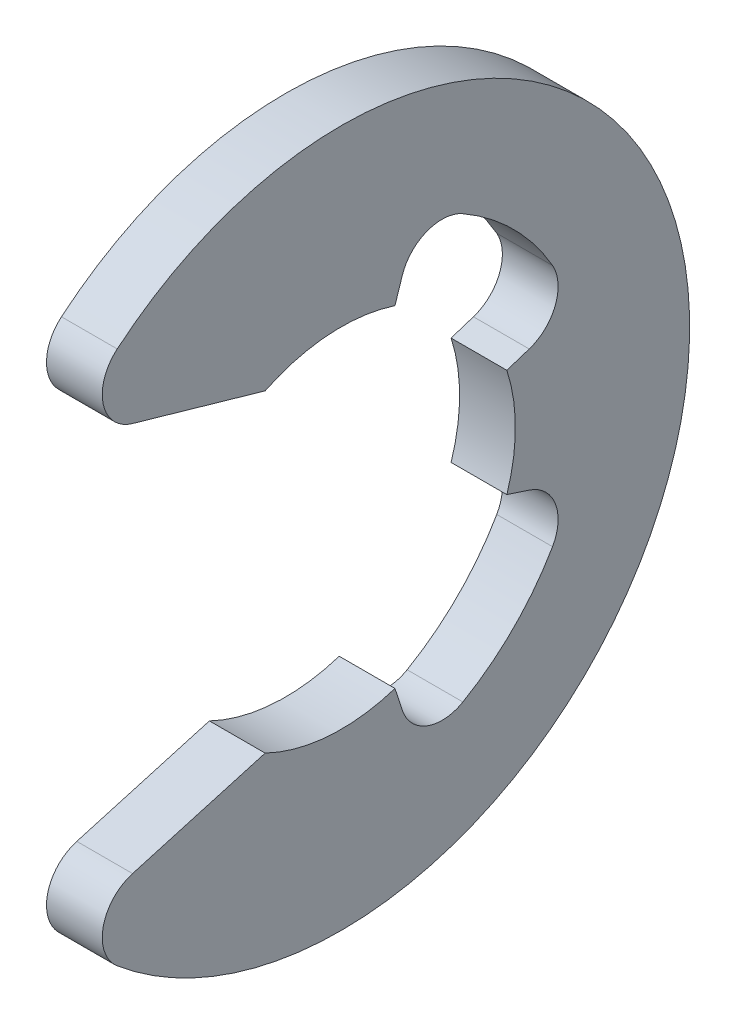
ISO-10303-21;
HEADER;
FILE_DESCRIPTION(('STEP AP214'),'2;1');
FILE_NAME('part.step','',(''),(''),'','','');
FILE_SCHEMA(('AUTOMOTIVE_DESIGN { 1 0 10303 214 1 1 1 1 }'));
ENDSEC;
DATA;
#1=APPLICATION_CONTEXT('core data for automotive mechanical design processes');
#2=APPLICATION_PROTOCOL_DEFINITION('international standard','automotive_design',2000,#1);
#3=PRODUCT_CONTEXT('',#1,'mechanical');
#4=PRODUCT('Part','Part','',(#3));
#5=PRODUCT_RELATED_PRODUCT_CATEGORY('part','',(#4));
#6=PRODUCT_DEFINITION_FORMATION('','',#4);
#7=PRODUCT_DEFINITION_CONTEXT('part definition',#1,'design');
#8=PRODUCT_DEFINITION('design','',#6,#7);
#9=PRODUCT_DEFINITION_SHAPE('','',#8);
#10=(LENGTH_UNIT() NAMED_UNIT(*) SI_UNIT(.MILLI.,.METRE.));
#11=(NAMED_UNIT(*) PLANE_ANGLE_UNIT() SI_UNIT($,.RADIAN.));
#12=(NAMED_UNIT(*) SI_UNIT($,.STERADIAN.) SOLID_ANGLE_UNIT());
#13=UNCERTAINTY_MEASURE_WITH_UNIT(LENGTH_MEASURE(1.E-05),#10,'distance_accuracy_value','');
#14=(GEOMETRIC_REPRESENTATION_CONTEXT(3) GLOBAL_UNCERTAINTY_ASSIGNED_CONTEXT((#13)) GLOBAL_UNIT_ASSIGNED_CONTEXT((#10,
#11,#12)) REPRESENTATION_CONTEXT('',''));
#15=CARTESIAN_POINT('',(0.,0.,0.));
#16=DIRECTION('',(0.,0.,1.));
#17=DIRECTION('',(1.,0.,0.));
#18=AXIS2_PLACEMENT_3D('',#15,#16,#17);
#19=CARTESIAN_POINT('',(0.8,0.,0.));
#20=DIRECTION('',(1.,0.,0.));
#21=DIRECTION('',(0.,1.,0.));
#22=AXIS2_PLACEMENT_3D('',#19,#20,#21);
#23=PLANE('',#22);
#24=DIRECTION('',(0.,-0.275637355817005,-0.961261695938317));
#25=VECTOR('',#24,1.);
#26=CARTESIAN_POINT('',(0.8,2.795405425422,2.991779494249));
#27=LINE('',#26,#25);
#28=CARTESIAN_POINT('',(0.8,2.795405425422,2.991779494249));
#29=VERTEX_POINT('',#28);
#30=CARTESIAN_POINT('',(0.8,2.25,1.089724735885));
#31=VERTEX_POINT('',#30);
#32=EDGE_CURVE('E11',#29,#31,#27,.T.);
#33=ORIENTED_EDGE('',*,*,#32,.T.);
#34=CARTESIAN_POINT('',(0.8,0.,0.));
#35=DIRECTION('',(-1.,0.,0.));
#36=DIRECTION('',(0.,0.899999999999987,0.435889894354094));
#37=AXIS2_PLACEMENT_3D('',#34,#35,#36);
#38=CIRCLE('',#37,2.5);
#39=CARTESIAN_POINT('',(0.8,2.377641290738,-0.7725424859374));
#40=VERTEX_POINT('',#39);
#41=EDGE_CURVE('E43',#31,#40,#38,.T.);
#42=ORIENTED_EDGE('',*,*,#41,.T.);
#43=DIRECTION('',(0.,0.951056516295172,-0.309016994374891));
#44=VECTOR('',#43,1.);
#45=CARTESIAN_POINT('',(0.8,2.377641290738,-0.7725424859374));
#46=LINE('',#45,#44);
#47=CARTESIAN_POINT('',(0.8,2.698387185405,-0.8767591446006));
#48=VERTEX_POINT('',#47);
#49=EDGE_CURVE('E226',#40,#48,#46,.T.);
#50=ORIENTED_EDGE('',*,*,#49,.T.);
#51=CARTESIAN_POINT('',(0.8,2.51297698878,-1.447393054378));
#52=DIRECTION('',(-1.,0.,0.));
#53=DIRECTION('',(0.,0.309016994374891,0.951056516295172));
#54=AXIS2_PLACEMENT_3D('',#51,#52,#53);
#55=CIRCLE('',#54,0.6);
#56=CARTESIAN_POINT('',(0.8,3.032903262321,-1.746853686318));
#57=VERTEX_POINT('',#56);
#58=EDGE_CURVE('E219',#48,#57,#55,.T.);
#59=ORIENTED_EDGE('',*,*,#58,.T.);
#60=CARTESIAN_POINT('',(0.8,0.,0.));
#61=DIRECTION('',(-1.,0.,0.));
#62=DIRECTION('',(0.,0.866543789234579,-0.499101053233688));
#63=AXIS2_PLACEMENT_3D('',#60,#61,#62);
#64=CIRCLE('',#63,3.5);
#65=CARTESIAN_POINT('',(0.8,1.746853686318,-3.032903262321));
#66=VERTEX_POINT('',#65);
#67=EDGE_CURVE('E186',#57,#66,#64,.T.);
#68=ORIENTED_EDGE('',*,*,#67,.T.);
#69=CARTESIAN_POINT('',(0.8,1.447393054378,-2.51297698878));
#70=DIRECTION('',(-1.,0.,0.));
#71=DIRECTION('',(0.,0.499101053233688,-0.866543789234579));
#72=AXIS2_PLACEMENT_3D('',#69,#70,#71);
#73=CIRCLE('',#72,0.6);
#74=CARTESIAN_POINT('',(0.8,0.8767591446006,-2.698387185405));
#75=VERTEX_POINT('',#74);
#76=EDGE_CURVE('E180',#66,#75,#73,.T.);
#77=ORIENTED_EDGE('',*,*,#76,.T.);
#78=DIRECTION('',(0.,-0.309016994374891,0.951056516295172));
#79=VECTOR('',#78,1.);
#80=CARTESIAN_POINT('',(0.8,0.8767591446006,-2.698387185405));
#81=LINE('',#80,#79);
#82=CARTESIAN_POINT('',(0.8,0.7725424859374,-2.377641290738));
#83=VERTEX_POINT('',#82);
#84=EDGE_CURVE('E183',#75,#83,#81,.T.);
#85=ORIENTED_EDGE('',*,*,#84,.T.);
#86=CARTESIAN_POINT('',(0.8,0.,0.));
#87=DIRECTION('',(-1.,0.,0.));
#88=DIRECTION('',(0.,0.309016994374891,-0.951056516295172));
#89=AXIS2_PLACEMENT_3D('',#86,#87,#88);
#90=CIRCLE('',#89,2.5);
#91=CARTESIAN_POINT('',(0.8,-0.7725424859374,-2.377641290738));
#92=VERTEX_POINT('',#91);
#93=EDGE_CURVE('E210',#83,#92,#90,.T.);
#94=ORIENTED_EDGE('',*,*,#93,.T.);
#95=DIRECTION('',(0.,-0.309016994374891,-0.951056516295172));
#96=VECTOR('',#95,1.);
#97=CARTESIAN_POINT('',(0.8,-0.7725424859374,-2.377641290738));
#98=LINE('',#97,#96);
#99=CARTESIAN_POINT('',(0.8,-0.8767591446006,-2.698387185405));
#100=VERTEX_POINT('',#99);
#101=EDGE_CURVE('E342',#92,#100,#98,.T.);
#102=ORIENTED_EDGE('',*,*,#101,.T.);
#103=CARTESIAN_POINT('',(0.8,-1.447393054378,-2.51297698878));
#104=DIRECTION('',(-1.,0.,0.));
#105=DIRECTION('',(0.,0.951056516295172,-0.309016994374891));
#106=AXIS2_PLACEMENT_3D('',#103,#104,#105);
#107=CIRCLE('',#106,0.6);
#108=CARTESIAN_POINT('',(0.8,-1.746853686318,-3.032903262321));
#109=VERTEX_POINT('',#108);
#110=EDGE_CURVE('E319',#100,#109,#107,.T.);
#111=ORIENTED_EDGE('',*,*,#110,.T.);
#112=CARTESIAN_POINT('',(0.8,0.,0.));
#113=DIRECTION('',(-1.,0.,0.));
#114=DIRECTION('',(0.,-0.499101053233688,-0.866543789234579));
#115=AXIS2_PLACEMENT_3D('',#112,#113,#114);
#116=CIRCLE('',#115,3.5);
#117=CARTESIAN_POINT('',(0.8,-3.032903262321,-1.746853686318));
#118=VERTEX_POINT('',#117);
#119=EDGE_CURVE('E320',#109,#118,#116,.T.);
#120=ORIENTED_EDGE('',*,*,#119,.T.);
#121=CARTESIAN_POINT('',(0.8,-2.51297698878,-1.447393054378));
#122=DIRECTION('',(-1.,0.,0.));
#123=DIRECTION('',(0.,-0.866543789234579,-0.499101053233688));
#124=AXIS2_PLACEMENT_3D('',#121,#122,#123);
#125=CIRCLE('',#124,0.6);
#126=CARTESIAN_POINT('',(0.8,-2.698387185405,-0.8767591446006));
#127=VERTEX_POINT('',#126);
#128=EDGE_CURVE('E331',#118,#127,#125,.T.);
#129=ORIENTED_EDGE('',*,*,#128,.T.);
#130=DIRECTION('',(0.,0.951056516295172,0.309016994374891));
#131=VECTOR('',#130,1.);
#132=CARTESIAN_POINT('',(0.8,-2.698387185405,-0.8767591446006));
#133=LINE('',#132,#131);
#134=CARTESIAN_POINT('',(0.8,-2.377641290738,-0.7725424859374));
#135=VERTEX_POINT('',#134);
#136=EDGE_CURVE('E324',#127,#135,#133,.T.);
#137=ORIENTED_EDGE('',*,*,#136,.T.);
#138=CARTESIAN_POINT('',(0.8,0.,0.));
#139=DIRECTION('',(-1.,0.,0.));
#140=DIRECTION('',(0.,-0.951056516295172,-0.309016994374891));
#141=AXIS2_PLACEMENT_3D('',#138,#139,#140);
#142=CIRCLE('',#141,2.5);
#143=CARTESIAN_POINT('',(0.8,-2.25,1.089724735885));
#144=VERTEX_POINT('',#143);
#145=EDGE_CURVE('E311',#135,#144,#142,.T.);
#146=ORIENTED_EDGE('',*,*,#145,.T.);
#147=DIRECTION('',(0.,-0.275637355817005,0.961261695938317));
#148=VECTOR('',#147,1.);
#149=CARTESIAN_POINT('',(0.8,-2.25,1.089724735885));
#150=LINE('',#149,#148);
#151=CARTESIAN_POINT('',(0.8,-2.795405425422,2.991779494249));
#152=VERTEX_POINT('',#151);
#153=EDGE_CURVE('E265',#144,#152,#150,.T.);
#154=ORIENTED_EDGE('',*,*,#153,.T.);
#155=CARTESIAN_POINT('',(0.8,-3.372162442985,2.826397080759));
#156=DIRECTION('',(1.,0.,0.));
#157=DIRECTION('',(0.,0.961261695938317,0.275637355817005));
#158=AXIS2_PLACEMENT_3D('',#155,#156,#157);
#159=CIRCLE('',#158,0.6);
#160=CARTESIAN_POINT('',(0.8,-3.832002776119,3.211814864499));
#161=VERTEX_POINT('',#160);
#162=EDGE_CURVE('E266',#152,#161,#159,.T.);
#163=ORIENTED_EDGE('',*,*,#162,.T.);
#164=CARTESIAN_POINT('',(0.8,0.,0.));
#165=DIRECTION('',(1.,0.,0.));
#166=DIRECTION('',(0.,-0.766400555223793,0.642362972899794));
#167=AXIS2_PLACEMENT_3D('',#164,#165,#166);
#168=CIRCLE('',#167,5.);
#169=CARTESIAN_POINT('',(0.8,3.832002776119,3.211814864499));
#170=VERTEX_POINT('',#169);
#171=EDGE_CURVE('E298',#161,#170,#168,.T.);
#172=ORIENTED_EDGE('',*,*,#171,.T.);
#173=CARTESIAN_POINT('',(0.8,3.372162442985,2.826397080759));
#174=DIRECTION('',(1.,0.,0.));
#175=DIRECTION('',(0.,0.766400555223793,0.642362972899794));
#176=AXIS2_PLACEMENT_3D('',#173,#174,#175);
#177=CIRCLE('',#176,0.6);
#178=EDGE_CURVE('E292',#170,#29,#177,.T.);
#179=ORIENTED_EDGE('',*,*,#178,.T.);
#180=EDGE_LOOP('',(#33,#42,#50,#59,#68,#77,#85,#94,#102,#111,#120,#129,#137,#146,#154,#163,#172,#179));
#181=FACE_BOUND('',#180,.T.);
#182=ADVANCED_FACE('F17',(#181),#23,.T.);
#183=CARTESIAN_POINT('',(0.,3.069326063365,3.947054283481));
#184=DIRECTION('',(0.,-0.961261695938317,0.275637355817005));
#185=DIRECTION('',(-1.,0.,0.));
#186=AXIS2_PLACEMENT_3D('',#183,#184,#185);
#187=PLANE('',#186);
#188=DIRECTION('',(0.,-0.275637355817005,-0.961261695938317));
#189=VECTOR('',#188,1.);
#190=CARTESIAN_POINT('',(0.,2.795405425422,2.991779494249));
#191=LINE('',#190,#189);
#192=CARTESIAN_POINT('',(0.,2.795405425422,2.991779494249));
#193=VERTEX_POINT('',#192);
#194=CARTESIAN_POINT('',(0.,2.25,1.089724735885));
#195=VERTEX_POINT('',#194);
#196=EDGE_CURVE('E278',#193,#195,#191,.T.);
#197=ORIENTED_EDGE('',*,*,#196,.T.);
#198=DIRECTION('',(1.,0.,0.));
#199=VECTOR('',#198,1.);
#200=CARTESIAN_POINT('',(0.,2.25,1.089724735885));
#201=LINE('',#200,#199);
#202=EDGE_CURVE('E26',#195,#31,#201,.T.);
#203=ORIENTED_EDGE('',*,*,#202,.T.);
#204=ORIENTED_EDGE('',*,*,#32,.F.);
#205=DIRECTION('',(-1.,0.,0.));
#206=VECTOR('',#205,1.);
#207=CARTESIAN_POINT('',(0.8,2.795405425422,2.991779494249));
#208=LINE('',#207,#206);
#209=EDGE_CURVE('E289',#29,#193,#208,.T.);
#210=ORIENTED_EDGE('',*,*,#209,.T.);
#211=EDGE_LOOP('',(#197,#203,#204,#210));
#212=FACE_BOUND('',#211,.T.);
#213=ADVANCED_FACE('F430',(#212),#187,.T.);
#214=CARTESIAN_POINT('',(0.,0.,0.));
#215=DIRECTION('',(1.,0.,0.));
#216=DIRECTION('',(0.,-1.,0.));
#217=AXIS2_PLACEMENT_3D('',#214,#215,#216);
#218=CYLINDRICAL_SURFACE('',#217,2.5);
#219=DIRECTION('',(1.,0.,0.));
#220=VECTOR('',#219,1.);
#221=CARTESIAN_POINT('',(0.,2.377641290738,-0.7725424859374));
#222=LINE('',#221,#220);
#223=CARTESIAN_POINT('',(0.,2.377641290738,-0.7725424859374));
#224=VERTEX_POINT('',#223);
#225=EDGE_CURVE('E229',#224,#40,#222,.T.);
#226=ORIENTED_EDGE('',*,*,#225,.T.);
#227=ORIENTED_EDGE('',*,*,#41,.F.);
#228=ORIENTED_EDGE('',*,*,#202,.F.);
#229=CARTESIAN_POINT('',(0.,0.,0.));
#230=DIRECTION('',(-1.,0.,0.));
#231=DIRECTION('',(0.,0.899999999999987,0.435889894354094));
#232=AXIS2_PLACEMENT_3D('',#229,#230,#231);
#233=CIRCLE('',#232,2.5);
#234=EDGE_CURVE('E274',#195,#224,#233,.T.);
#235=ORIENTED_EDGE('',*,*,#234,.T.);
#236=EDGE_LOOP('',(#226,#227,#228,#235));
#237=FACE_BOUND('',#236,.T.);
#238=ADVANCED_FACE('F19',(#237),#218,.F.);
#239=CARTESIAN_POINT('',(0.,2.377641290738,-0.7725424859374));
#240=DIRECTION('',(0.,-0.309016994374891,-0.951056516295172));
#241=DIRECTION('',(0.,-0.951056516295172,0.309016994374891));
#242=AXIS2_PLACEMENT_3D('',#239,#240,#241);
#243=PLANE('',#242);
#244=ORIENTED_EDGE('',*,*,#49,.F.);
#245=ORIENTED_EDGE('',*,*,#225,.F.);
#246=DIRECTION('',(0.,0.951056516295172,-0.309016994374891));
#247=VECTOR('',#246,1.);
#248=CARTESIAN_POINT('',(0.,2.377641290738,-0.7725424859374));
#249=LINE('',#248,#247);
#250=CARTESIAN_POINT('',(0.,2.698387185405,-0.8767591446006));
#251=VERTEX_POINT('',#250);
#252=EDGE_CURVE('E279',#224,#251,#249,.T.);
#253=ORIENTED_EDGE('',*,*,#252,.T.);
#254=DIRECTION('',(1.,0.,0.));
#255=VECTOR('',#254,1.);
#256=CARTESIAN_POINT('',(0.,2.698387185405,-0.8767591446006));
#257=LINE('',#256,#255);
#258=EDGE_CURVE('E222',#251,#48,#257,.T.);
#259=ORIENTED_EDGE('',*,*,#258,.T.);
#260=EDGE_LOOP('',(#244,#245,#253,#259));
#261=FACE_BOUND('',#260,.T.);
#262=ADVANCED_FACE('F424',(#261),#243,.T.);
#263=CARTESIAN_POINT('',(-1.04288,2.51297698878,-1.447393054378));
#264=DIRECTION('',(1.,0.,0.));
#265=DIRECTION('',(0.,0.866543789234579,-0.499101053233688));
#266=AXIS2_PLACEMENT_3D('',#263,#264,#265);
#267=CYLINDRICAL_SURFACE('',#266,0.6);
#268=ORIENTED_EDGE('',*,*,#58,.F.);
#269=ORIENTED_EDGE('',*,*,#258,.F.);
#270=CARTESIAN_POINT('',(0.,2.51297698878,-1.447393054378));
#271=DIRECTION('',(1.,0.,0.));
#272=DIRECTION('',(0.,0.866543789234579,-0.499101053233688));
#273=AXIS2_PLACEMENT_3D('',#270,#271,#272);
#274=CIRCLE('',#273,0.6);
#275=CARTESIAN_POINT('',(0.,3.032903262321,-1.746853686318));
#276=VERTEX_POINT('',#275);
#277=EDGE_CURVE('E273',#276,#251,#274,.T.);
#278=ORIENTED_EDGE('',*,*,#277,.F.);
#279=DIRECTION('',(1.,0.,0.));
#280=VECTOR('',#279,1.);
#281=CARTESIAN_POINT('',(0.,3.032903262321,-1.746853686318));
#282=LINE('',#281,#280);
#283=EDGE_CURVE('E215',#276,#57,#282,.T.);
#284=ORIENTED_EDGE('',*,*,#283,.T.);
#285=EDGE_LOOP('',(#268,#269,#278,#284));
#286=FACE_BOUND('',#285,.T.);
#287=ADVANCED_FACE('F420',(#286),#267,.F.);
#288=CARTESIAN_POINT('',(0.,0.,0.));
#289=DIRECTION('',(1.,0.,0.));
#290=DIRECTION('',(0.,-1.,0.));
#291=AXIS2_PLACEMENT_3D('',#288,#289,#290);
#292=CYLINDRICAL_SURFACE('',#291,3.5);
#293=ORIENTED_EDGE('',*,*,#67,.F.);
#294=ORIENTED_EDGE('',*,*,#283,.F.);
#295=CARTESIAN_POINT('',(0.,0.,0.));
#296=DIRECTION('',(-1.,0.,0.));
#297=DIRECTION('',(0.,0.866543789234579,-0.499101053233688));
#298=AXIS2_PLACEMENT_3D('',#295,#296,#297);
#299=CIRCLE('',#298,3.5);
#300=CARTESIAN_POINT('',(0.,1.746853686318,-3.032903262321));
#301=VERTEX_POINT('',#300);
#302=EDGE_CURVE('E269',#276,#301,#299,.T.);
#303=ORIENTED_EDGE('',*,*,#302,.T.);
#304=DIRECTION('',(1.,0.,0.));
#305=VECTOR('',#304,1.);
#306=CARTESIAN_POINT('',(0.,1.746853686318,-3.032903262321));
#307=LINE('',#306,#305);
#308=EDGE_CURVE('E190',#301,#66,#307,.T.);
#309=ORIENTED_EDGE('',*,*,#308,.T.);
#310=EDGE_LOOP('',(#293,#294,#303,#309));
#311=FACE_BOUND('',#310,.T.);
#312=ADVANCED_FACE('F417',(#311),#292,.F.);
#313=CARTESIAN_POINT('',(-1.04288,1.447393054378,-2.51297698878));
#314=DIRECTION('',(1.,0.,0.));
#315=DIRECTION('',(0.,-0.951056516295172,-0.309016994374891));
#316=AXIS2_PLACEMENT_3D('',#313,#314,#315);
#317=CYLINDRICAL_SURFACE('',#316,0.6);
#318=ORIENTED_EDGE('',*,*,#76,.F.);
#319=ORIENTED_EDGE('',*,*,#308,.F.);
#320=CARTESIAN_POINT('',(0.,1.447393054378,-2.51297698878));
#321=DIRECTION('',(1.,0.,0.));
#322=DIRECTION('',(0.,-0.951056516295172,-0.309016994374891));
#323=AXIS2_PLACEMENT_3D('',#320,#321,#322);
#324=CIRCLE('',#323,0.6);
#325=CARTESIAN_POINT('',(0.,0.8767591446006,-2.698387185405));
#326=VERTEX_POINT('',#325);
#327=EDGE_CURVE('E196',#326,#301,#324,.T.);
#328=ORIENTED_EDGE('',*,*,#327,.F.);
#329=DIRECTION('',(1.,0.,0.));
#330=VECTOR('',#329,1.);
#331=CARTESIAN_POINT('',(0.,0.8767591446006,-2.698387185405));
#332=LINE('',#331,#330);
#333=EDGE_CURVE('E191',#326,#75,#332,.T.);
#334=ORIENTED_EDGE('',*,*,#333,.T.);
#335=EDGE_LOOP('',(#318,#319,#328,#334));
#336=FACE_BOUND('',#335,.T.);
#337=ADVANCED_FACE('F194',(#336),#317,.F.);
#338=CARTESIAN_POINT('',(0.,1.081559480312,-3.328697807033));
#339=DIRECTION('',(0.,0.951056516295172,0.309016994374891));
#340=DIRECTION('',(1.,0.,0.));
#341=AXIS2_PLACEMENT_3D('',#338,#339,#340);
#342=PLANE('',#341);
#343=DIRECTION('',(0.,-0.309016994374891,0.951056516295172));
#344=VECTOR('',#343,1.);
#345=CARTESIAN_POINT('',(0.,0.8767591446006,-2.698387185405));
#346=LINE('',#345,#344);
#347=CARTESIAN_POINT('',(0.,0.7725424859374,-2.377641290738));
#348=VERTEX_POINT('',#347);
#349=EDGE_CURVE('E259',#326,#348,#346,.T.);
#350=ORIENTED_EDGE('',*,*,#349,.T.);
#351=DIRECTION('',(1.,0.,0.));
#352=VECTOR('',#351,1.);
#353=CARTESIAN_POINT('',(0.,0.7725424859374,-2.377641290738));
#354=LINE('',#353,#352);
#355=EDGE_CURVE('E203',#348,#83,#354,.T.);
#356=ORIENTED_EDGE('',*,*,#355,.T.);
#357=ORIENTED_EDGE('',*,*,#84,.F.);
#358=ORIENTED_EDGE('',*,*,#333,.F.);
#359=EDGE_LOOP('',(#350,#356,#357,#358));
#360=FACE_BOUND('',#359,.T.);
#361=ADVANCED_FACE('F202',(#360),#342,.T.);
#362=CARTESIAN_POINT('',(0.,0.,0.));
#363=DIRECTION('',(1.,0.,0.));
#364=DIRECTION('',(0.,-1.,0.));
#365=AXIS2_PLACEMENT_3D('',#362,#363,#364);
#366=CYLINDRICAL_SURFACE('',#365,2.5);
#367=DIRECTION('',(1.,0.,0.));
#368=VECTOR('',#367,1.);
#369=CARTESIAN_POINT('',(0.,-0.7725424859374,-2.377641290738));
#370=LINE('',#369,#368);
#371=CARTESIAN_POINT('',(0.,-0.7725424859374,-2.377641290738));
#372=VERTEX_POINT('',#371);
#373=EDGE_CURVE('E344',#372,#92,#370,.T.);
#374=ORIENTED_EDGE('',*,*,#373,.T.);
#375=ORIENTED_EDGE('',*,*,#93,.F.);
#376=ORIENTED_EDGE('',*,*,#355,.F.);
#377=CARTESIAN_POINT('',(0.,0.,0.));
#378=DIRECTION('',(-1.,0.,0.));
#379=DIRECTION('',(0.,0.309016994374891,-0.951056516295172));
#380=AXIS2_PLACEMENT_3D('',#377,#378,#379);
#381=CIRCLE('',#380,2.5);
#382=EDGE_CURVE('E255',#348,#372,#381,.T.);
#383=ORIENTED_EDGE('',*,*,#382,.T.);
#384=EDGE_LOOP('',(#374,#375,#376,#383));
#385=FACE_BOUND('',#384,.T.);
#386=ADVANCED_FACE('F412',(#385),#366,.F.);
#387=CARTESIAN_POINT('',(0.,-0.7725424859374,-2.377641290738));
#388=DIRECTION('',(0.,-0.951056516295172,0.309016994374891));
#389=DIRECTION('',(-1.,0.,0.));
#390=AXIS2_PLACEMENT_3D('',#387,#388,#389);
#391=PLANE('',#390);
#392=ORIENTED_EDGE('',*,*,#101,.F.);
#393=ORIENTED_EDGE('',*,*,#373,.F.);
#394=DIRECTION('',(0.,-0.309016994374891,-0.951056516295172));
#395=VECTOR('',#394,1.);
#396=CARTESIAN_POINT('',(0.,-0.7725424859374,-2.377641290738));
#397=LINE('',#396,#395);
#398=CARTESIAN_POINT('',(0.,-0.8767591446006,-2.698387185405));
#399=VERTEX_POINT('',#398);
#400=EDGE_CURVE('E242',#372,#399,#397,.T.);
#401=ORIENTED_EDGE('',*,*,#400,.T.);
#402=DIRECTION('',(1.,0.,0.));
#403=VECTOR('',#402,1.);
#404=CARTESIAN_POINT('',(0.,-0.8767591446006,-2.698387185405));
#405=LINE('',#404,#403);
#406=EDGE_CURVE('E341',#399,#100,#405,.T.);
#407=ORIENTED_EDGE('',*,*,#406,.T.);
#408=EDGE_LOOP('',(#392,#393,#401,#407));
#409=FACE_BOUND('',#408,.T.);
#410=ADVANCED_FACE('F410',(#409),#391,.T.);
#411=CARTESIAN_POINT('',(-1.04288,-1.447393054378,-2.51297698878));
#412=DIRECTION('',(1.,0.,0.));
#413=DIRECTION('',(0.,-0.499101053233688,-0.866543789234579));
#414=AXIS2_PLACEMENT_3D('',#411,#412,#413);
#415=CYLINDRICAL_SURFACE('',#414,0.6);
#416=ORIENTED_EDGE('',*,*,#110,.F.);
#417=ORIENTED_EDGE('',*,*,#406,.F.);
#418=CARTESIAN_POINT('',(0.,-1.447393054378,-2.51297698878));
#419=DIRECTION('',(1.,0.,0.));
#420=DIRECTION('',(0.,-0.499101053233688,-0.866543789234579));
#421=AXIS2_PLACEMENT_3D('',#418,#419,#420);
#422=CIRCLE('',#421,0.6);
#423=CARTESIAN_POINT('',(0.,-1.746853686318,-3.032903262321));
#424=VERTEX_POINT('',#423);
#425=EDGE_CURVE('E251',#424,#399,#422,.T.);
#426=ORIENTED_EDGE('',*,*,#425,.F.);
#427=DIRECTION('',(1.,0.,0.));
#428=VECTOR('',#427,1.);
#429=CARTESIAN_POINT('',(0.,-1.746853686318,-3.032903262321));
#430=LINE('',#429,#428);
#431=EDGE_CURVE('E315',#424,#109,#430,.T.);
#432=ORIENTED_EDGE('',*,*,#431,.T.);
#433=EDGE_LOOP('',(#416,#417,#426,#432));
#434=FACE_BOUND('',#433,.T.);
#435=ADVANCED_FACE('F404',(#434),#415,.F.);
#436=CARTESIAN_POINT('',(0.,0.,0.));
#437=DIRECTION('',(1.,0.,0.));
#438=DIRECTION('',(0.,-1.,0.));
#439=AXIS2_PLACEMENT_3D('',#436,#437,#438);
#440=CYLINDRICAL_SURFACE('',#439,3.5);
#441=CARTESIAN_POINT('',(0.,0.,0.));
#442=DIRECTION('',(-1.,0.,0.));
#443=DIRECTION('',(0.,-0.499101053233688,-0.866543789234579));
#444=AXIS2_PLACEMENT_3D('',#441,#442,#443);
#445=CIRCLE('',#444,3.5);
#446=CARTESIAN_POINT('',(0.,-3.032903262321,-1.746853686318));
#447=VERTEX_POINT('',#446);
#448=EDGE_CURVE('E249',#424,#447,#445,.T.);
#449=ORIENTED_EDGE('',*,*,#448,.T.);
#450=DIRECTION('',(1.,0.,0.));
#451=VECTOR('',#450,1.);
#452=CARTESIAN_POINT('',(0.,-3.032903262321,-1.746853686318));
#453=LINE('',#452,#451);
#454=EDGE_CURVE('E334',#447,#118,#453,.T.);
#455=ORIENTED_EDGE('',*,*,#454,.T.);
#456=ORIENTED_EDGE('',*,*,#119,.F.);
#457=ORIENTED_EDGE('',*,*,#431,.F.);
#458=EDGE_LOOP('',(#449,#455,#456,#457));
#459=FACE_BOUND('',#458,.T.);
#460=ADVANCED_FACE('F392',(#459),#440,.F.);
#461=CARTESIAN_POINT('',(-1.04288,-2.51297698878,-1.447393054378));
#462=DIRECTION('',(1.,0.,0.));
#463=DIRECTION('',(0.,-0.309016994374891,0.951056516295172));
#464=AXIS2_PLACEMENT_3D('',#461,#462,#463);
#465=CYLINDRICAL_SURFACE('',#464,0.6);
#466=ORIENTED_EDGE('',*,*,#128,.F.);
#467=ORIENTED_EDGE('',*,*,#454,.F.);
#468=CARTESIAN_POINT('',(0.,-2.51297698878,-1.447393054378));
#469=DIRECTION('',(1.,0.,0.));
#470=DIRECTION('',(0.,-0.309016994374891,0.951056516295172));
#471=AXIS2_PLACEMENT_3D('',#468,#469,#470);
#472=CIRCLE('',#471,0.6);
#473=CARTESIAN_POINT('',(0.,-2.698387185405,-0.8767591446006));
#474=VERTEX_POINT('',#473);
#475=EDGE_CURVE('E245',#474,#447,#472,.T.);
#476=ORIENTED_EDGE('',*,*,#475,.F.);
#477=DIRECTION('',(1.,0.,0.));
#478=VECTOR('',#477,1.);
#479=CARTESIAN_POINT('',(0.,-2.698387185405,-0.8767591446006));
#480=LINE('',#479,#478);
#481=EDGE_CURVE('E327',#474,#127,#480,.T.);
#482=ORIENTED_EDGE('',*,*,#481,.T.);
#483=EDGE_LOOP('',(#466,#467,#476,#482));
#484=FACE_BOUND('',#483,.T.);
#485=ADVANCED_FACE('F401',(#484),#465,.F.);
#486=CARTESIAN_POINT('',(0.,-3.328697807033,-1.081559480312));
#487=DIRECTION('',(0.,0.309016994374891,-0.951056516295172));
#488=DIRECTION('',(-1.,0.,0.));
#489=AXIS2_PLACEMENT_3D('',#486,#487,#488);
#490=PLANE('',#489);
#491=DIRECTION('',(0.,0.951056516295172,0.309016994374891));
#492=VECTOR('',#491,1.);
#493=CARTESIAN_POINT('',(0.,-2.698387185405,-0.8767591446006));
#494=LINE('',#493,#492);
#495=CARTESIAN_POINT('',(0.,-2.377641290738,-0.7725424859374));
#496=VERTEX_POINT('',#495);
#497=EDGE_CURVE('E250',#474,#496,#494,.T.);
#498=ORIENTED_EDGE('',*,*,#497,.T.);
#499=DIRECTION('',(1.,0.,0.));
#500=VECTOR('',#499,1.);
#501=CARTESIAN_POINT('',(0.,-2.377641290738,-0.7725424859374));
#502=LINE('',#501,#500);
#503=EDGE_CURVE('E314',#496,#135,#502,.T.);
#504=ORIENTED_EDGE('',*,*,#503,.T.);
#505=ORIENTED_EDGE('',*,*,#136,.F.);
#506=ORIENTED_EDGE('',*,*,#481,.F.);
#507=EDGE_LOOP('',(#498,#504,#505,#506));
#508=FACE_BOUND('',#507,.T.);
#509=ADVANCED_FACE('F453',(#508),#490,.T.);
#510=CARTESIAN_POINT('',(0.,0.,0.));
#511=DIRECTION('',(1.,0.,0.));
#512=DIRECTION('',(0.,-1.,0.));
#513=AXIS2_PLACEMENT_3D('',#510,#511,#512);
#514=CYLINDRICAL_SURFACE('',#513,2.5);
#515=DIRECTION('',(1.,0.,0.));
#516=VECTOR('',#515,1.);
#517=CARTESIAN_POINT('',(0.,-2.25,1.089724735885));
#518=LINE('',#517,#516);
#519=CARTESIAN_POINT('',(0.,-2.25,1.089724735885));
#520=VERTEX_POINT('',#519);
#521=EDGE_CURVE('E285',#520,#144,#518,.T.);
#522=ORIENTED_EDGE('',*,*,#521,.T.);
#523=ORIENTED_EDGE('',*,*,#145,.F.);
#524=ORIENTED_EDGE('',*,*,#503,.F.);
#525=CARTESIAN_POINT('',(0.,0.,0.));
#526=DIRECTION('',(-1.,0.,0.));
#527=DIRECTION('',(0.,-0.951056516295172,-0.309016994374891));
#528=AXIS2_PLACEMENT_3D('',#525,#526,#527);
#529=CIRCLE('',#528,2.5);
#530=EDGE_CURVE('E365',#496,#520,#529,.T.);
#531=ORIENTED_EDGE('',*,*,#530,.T.);
#532=EDGE_LOOP('',(#522,#523,#524,#531));
#533=FACE_BOUND('',#532,.T.);
#534=ADVANCED_FACE('F452',(#533),#514,.F.);
#535=CARTESIAN_POINT('',(0.,-2.25,1.089724735885));
#536=DIRECTION('',(0.,0.961261695938317,0.275637355817005));
#537=DIRECTION('',(1.,0.,0.));
#538=AXIS2_PLACEMENT_3D('',#535,#536,#537);
#539=PLANE('',#538);
#540=ORIENTED_EDGE('',*,*,#153,.F.);
#541=ORIENTED_EDGE('',*,*,#521,.F.);
#542=DIRECTION('',(0.,-0.275637355817005,0.961261695938317));
#543=VECTOR('',#542,1.);
#544=CARTESIAN_POINT('',(0.,-2.25,1.089724735885));
#545=LINE('',#544,#543);
#546=CARTESIAN_POINT('',(0.,-2.795405425422,2.991779494249));
#547=VERTEX_POINT('',#546);
#548=EDGE_CURVE('E363',#520,#547,#545,.T.);
#549=ORIENTED_EDGE('',*,*,#548,.T.);
#550=DIRECTION('',(-1.,0.,0.));
#551=VECTOR('',#550,1.);
#552=CARTESIAN_POINT('',(0.8,-2.795405425422,2.991779494249));
#553=LINE('',#552,#551);
#554=EDGE_CURVE('E262',#152,#547,#553,.T.);
#555=ORIENTED_EDGE('',*,*,#554,.F.);
#556=EDGE_LOOP('',(#540,#541,#549,#555));
#557=FACE_BOUND('',#556,.T.);
#558=ADVANCED_FACE('F450',(#557),#539,.T.);
#559=CARTESIAN_POINT('',(1.84288,-3.372162442985,2.826397080759));
#560=DIRECTION('',(-1.,0.,0.));
#561=DIRECTION('',(0.,-0.766400555223793,0.642362972899794));
#562=AXIS2_PLACEMENT_3D('',#559,#560,#561);
#563=CYLINDRICAL_SURFACE('',#562,0.6);
#564=DIRECTION('',(-1.,0.,0.));
#565=VECTOR('',#564,1.);
#566=CARTESIAN_POINT('',(0.8,-3.832002776119,3.211814864499));
#567=LINE('',#566,#565);
#568=CARTESIAN_POINT('',(0.,-3.832002776119,3.211814864499));
#569=VERTEX_POINT('',#568);
#570=EDGE_CURVE('E303',#161,#569,#567,.T.);
#571=ORIENTED_EDGE('',*,*,#570,.F.);
#572=ORIENTED_EDGE('',*,*,#162,.F.);
#573=ORIENTED_EDGE('',*,*,#554,.T.);
#574=CARTESIAN_POINT('',(0.,-3.372162442985,2.826397080759));
#575=DIRECTION('',(-1.,0.,0.));
#576=DIRECTION('',(0.,-0.766400555223793,0.642362972899794));
#577=AXIS2_PLACEMENT_3D('',#574,#575,#576);
#578=CIRCLE('',#577,0.6);
#579=EDGE_CURVE('E361',#569,#547,#578,.T.);
#580=ORIENTED_EDGE('',*,*,#579,.F.);
#581=EDGE_LOOP('',(#571,#572,#573,#580));
#582=FACE_BOUND('',#581,.T.);
#583=ADVANCED_FACE('F445',(#582),#563,.T.);
#584=CARTESIAN_POINT('',(0.,0.,0.));
#585=DIRECTION('',(1.,0.,0.));
#586=DIRECTION('',(0.,-1.,0.));
#587=AXIS2_PLACEMENT_3D('',#584,#585,#586);
#588=CYLINDRICAL_SURFACE('',#587,5.);
#589=ORIENTED_EDGE('',*,*,#171,.F.);
#590=ORIENTED_EDGE('',*,*,#570,.T.);
#591=CARTESIAN_POINT('',(0.,0.,0.));
#592=DIRECTION('',(1.,0.,0.));
#593=DIRECTION('',(0.,-0.766400555223793,0.642362972899794));
#594=AXIS2_PLACEMENT_3D('',#591,#592,#593);
#595=CIRCLE('',#594,5.);
#596=CARTESIAN_POINT('',(0.,3.832002776119,3.211814864499));
#597=VERTEX_POINT('',#596);
#598=EDGE_CURVE('E384',#569,#597,#595,.T.);
#599=ORIENTED_EDGE('',*,*,#598,.T.);
#600=DIRECTION('',(-1.,0.,0.));
#601=VECTOR('',#600,1.);
#602=CARTESIAN_POINT('',(0.8,3.832002776119,3.211814864499));
#603=LINE('',#602,#601);
#604=EDGE_CURVE('E295',#170,#597,#603,.T.);
#605=ORIENTED_EDGE('',*,*,#604,.F.);
#606=EDGE_LOOP('',(#589,#590,#599,#605));
#607=FACE_BOUND('',#606,.T.);
#608=ADVANCED_FACE('F440',(#607),#588,.T.);
#609=CARTESIAN_POINT('',(1.84288,3.372162442985,2.826397080759));
#610=DIRECTION('',(-1.,0.,0.));
#611=DIRECTION('',(0.,-0.961261695938317,0.275637355817005));
#612=AXIS2_PLACEMENT_3D('',#609,#610,#611);
#613=CYLINDRICAL_SURFACE('',#612,0.6);
#614=ORIENTED_EDGE('',*,*,#209,.F.);
#615=ORIENTED_EDGE('',*,*,#178,.F.);
#616=ORIENTED_EDGE('',*,*,#604,.T.);
#617=CARTESIAN_POINT('',(0.,3.372162442985,2.826397080759));
#618=DIRECTION('',(-1.,0.,0.));
#619=DIRECTION('',(0.,-0.961261695938317,0.275637355817005));
#620=AXIS2_PLACEMENT_3D('',#617,#618,#619);
#621=CIRCLE('',#620,0.6);
#622=EDGE_CURVE('E282',#193,#597,#621,.T.);
#623=ORIENTED_EDGE('',*,*,#622,.F.);
#624=EDGE_LOOP('',(#614,#615,#616,#623));
#625=FACE_BOUND('',#624,.T.);
#626=ADVANCED_FACE('F435',(#625),#613,.T.);
#627=CARTESIAN_POINT('',(0.,0.,0.));
#628=DIRECTION('',(1.,0.,0.));
#629=DIRECTION('',(0.,1.,0.));
#630=AXIS2_PLACEMENT_3D('',#627,#628,#629);
#631=PLANE('',#630);
#632=ORIENTED_EDGE('',*,*,#598,.F.);
#633=ORIENTED_EDGE('',*,*,#579,.T.);
#634=ORIENTED_EDGE('',*,*,#548,.F.);
#635=ORIENTED_EDGE('',*,*,#530,.F.);
#636=ORIENTED_EDGE('',*,*,#497,.F.);
#637=ORIENTED_EDGE('',*,*,#475,.T.);
#638=ORIENTED_EDGE('',*,*,#448,.F.);
#639=ORIENTED_EDGE('',*,*,#425,.T.);
#640=ORIENTED_EDGE('',*,*,#400,.F.);
#641=ORIENTED_EDGE('',*,*,#382,.F.);
#642=ORIENTED_EDGE('',*,*,#349,.F.);
#643=ORIENTED_EDGE('',*,*,#327,.T.);
#644=ORIENTED_EDGE('',*,*,#302,.F.);
#645=ORIENTED_EDGE('',*,*,#277,.T.);
#646=ORIENTED_EDGE('',*,*,#252,.F.);
#647=ORIENTED_EDGE('',*,*,#234,.F.);
#648=ORIENTED_EDGE('',*,*,#196,.F.);
#649=ORIENTED_EDGE('',*,*,#622,.T.);
#650=EDGE_LOOP('',(#632,#633,#634,#635,#636,#637,#638,#639,#640,#641,#642,#643,#644,#645,#646,
#647,#648,#649));
#651=FACE_BOUND('',#650,.T.);
#652=ADVANCED_FACE('F399',(#651),#631,.F.);
#653=CLOSED_SHELL('',(#182,#213,#238,#262,#287,#312,#337,#361,#386,#410,#435,#460,#485,#509,
#534,#558,#583,#608,#626,#652));
#654=MANIFOLD_SOLID_BREP('B1',#653);
#655=ADVANCED_BREP_SHAPE_REPRESENTATION('',(#18,#654),#14);
#656=SHAPE_DEFINITION_REPRESENTATION(#9,#655);
ENDSEC;
END-ISO-10303-21;
